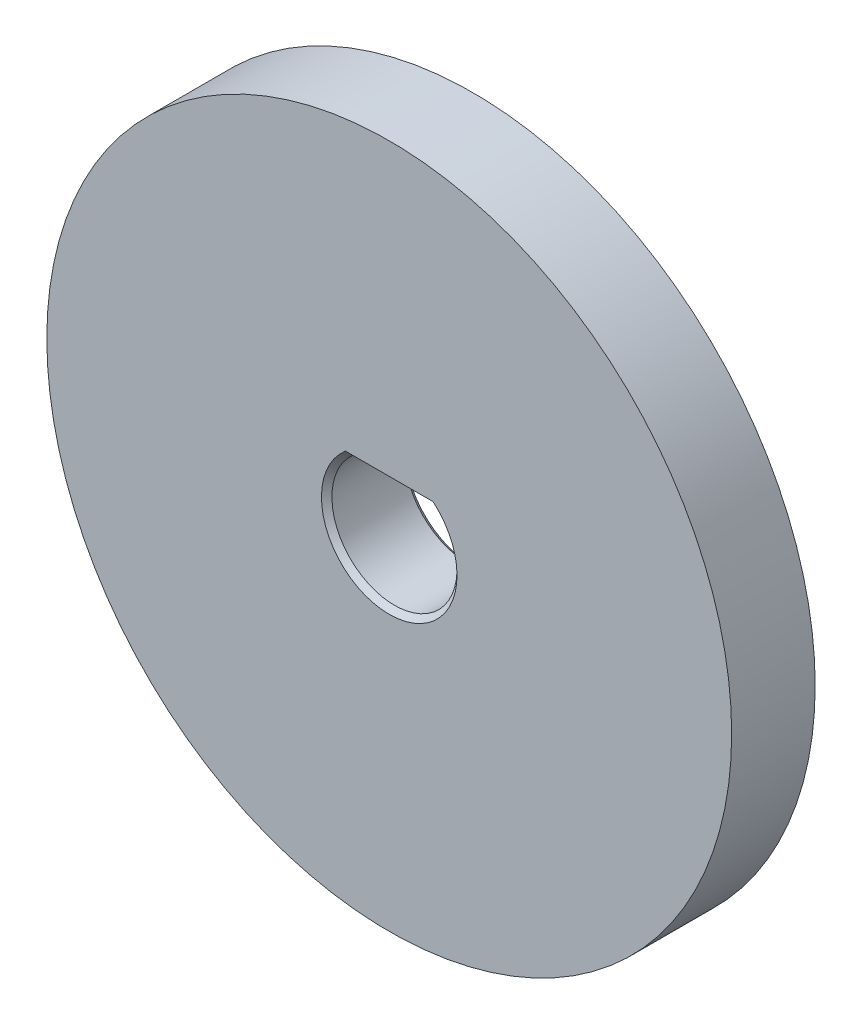
ISO-10303-21;
HEADER;
FILE_DESCRIPTION(('STEP AP214'),'2;1');
FILE_NAME('part.step','',(''),(''),'','','');
FILE_SCHEMA(('AUTOMOTIVE_DESIGN { 1 0 10303 214 1 1 1 1 }'));
ENDSEC;
DATA;
#1=APPLICATION_CONTEXT('core data for automotive mechanical design processes');
#2=APPLICATION_PROTOCOL_DEFINITION('international standard','automotive_design',2000,#1);
#3=PRODUCT_CONTEXT('',#1,'mechanical');
#4=PRODUCT('Part','Part','',(#3));
#5=PRODUCT_RELATED_PRODUCT_CATEGORY('part','',(#4));
#6=PRODUCT_DEFINITION_FORMATION('','',#4);
#7=PRODUCT_DEFINITION_CONTEXT('part definition',#1,'design');
#8=PRODUCT_DEFINITION('design','',#6,#7);
#9=PRODUCT_DEFINITION_SHAPE('','',#8);
#10=(LENGTH_UNIT() NAMED_UNIT(*) SI_UNIT(.MILLI.,.METRE.));
#11=(NAMED_UNIT(*) PLANE_ANGLE_UNIT() SI_UNIT($,.RADIAN.));
#12=(NAMED_UNIT(*) SI_UNIT($,.STERADIAN.) SOLID_ANGLE_UNIT());
#13=UNCERTAINTY_MEASURE_WITH_UNIT(LENGTH_MEASURE(1.E-05),#10,'distance_accuracy_value','');
#14=(GEOMETRIC_REPRESENTATION_CONTEXT(3) GLOBAL_UNCERTAINTY_ASSIGNED_CONTEXT((#13)) GLOBAL_UNIT_ASSIGNED_CONTEXT((#10,
#11,#12)) REPRESENTATION_CONTEXT('',''));
#15=CARTESIAN_POINT('',(0.,0.,0.));
#16=DIRECTION('',(0.,0.,1.));
#17=DIRECTION('',(1.,0.,0.));
#18=AXIS2_PLACEMENT_3D('',#15,#16,#17);
#19=CARTESIAN_POINT('',(0.,0.,6.35));
#20=DIRECTION('',(0.,0.,1.));
#21=DIRECTION('',(1.,0.,0.));
#22=AXIS2_PLACEMENT_3D('',#19,#20,#21);
#23=PLANE('',#22);
#24=DIRECTION('',(1.,0.,0.));
#25=VECTOR('',#24,1.);
#26=CARTESIAN_POINT('',(0.,7.86892000000001,6.35));
#27=LINE('',#26,#25);
#28=CARTESIAN_POINT('',(-6.65739766094843,7.86892000000001,6.35));
#29=VERTEX_POINT('',#28);
#30=CARTESIAN_POINT('',(6.65739766094843,7.86892000000001,6.35));
#31=VERTEX_POINT('',#30);
#32=EDGE_CURVE('E111',#29,#31,#27,.T.);
#33=ORIENTED_EDGE('',*,*,#32,.T.);
#34=CARTESIAN_POINT('',(0.,0.,6.35));
#35=DIRECTION('',(0.,0.,1.));
#36=DIRECTION('',(1.,0.,0.));
#37=AXIS2_PLACEMENT_3D('',#34,#35,#36);
#38=CIRCLE('',#37,10.30732);
#39=EDGE_CURVE('E119',#31,#29,#38,.F.);
#40=ORIENTED_EDGE('',*,*,#39,.T.);
#41=EDGE_LOOP('',(#33,#40));
#42=FACE_BOUND('',#41,.T.);
#43=CARTESIAN_POINT('',(0.,0.,6.35));
#44=DIRECTION('',(0.,0.,1.));
#45=DIRECTION('',(1.,0.,0.));
#46=AXIS2_PLACEMENT_3D('',#43,#44,#45);
#47=CIRCLE('',#46,52.07);
#48=CARTESIAN_POINT('',(52.07,0.,6.35));
#49=VERTEX_POINT('',#48);
#50=EDGE_CURVE('E121',#49,#49,#47,.T.);
#51=ORIENTED_EDGE('',*,*,#50,.T.);
#52=EDGE_LOOP('',(#51));
#53=FACE_BOUND('',#52,.T.);
#54=ADVANCED_FACE('F38',(#42,#53),#23,.T.);
#55=CARTESIAN_POINT('',(0.,0.,-6.35));
#56=DIRECTION('',(0.,0.,1.));
#57=DIRECTION('',(1.,0.,0.));
#58=AXIS2_PLACEMENT_3D('',#55,#56,#57);
#59=PLANE('',#58);
#60=CARTESIAN_POINT('',(0.,0.,-6.35));
#61=DIRECTION('',(0.,0.,1.));
#62=DIRECTION('',(1.,0.,0.));
#63=AXIS2_PLACEMENT_3D('',#60,#61,#62);
#64=CIRCLE('',#63,10.30732);
#65=CARTESIAN_POINT('',(-6.65739766094842,7.86891999999988,-6.35));
#66=VERTEX_POINT('',#65);
#67=CARTESIAN_POINT('',(6.65739766094842,7.86891999999988,-6.35));
#68=VERTEX_POINT('',#67);
#69=EDGE_CURVE('E53',#66,#68,#64,.T.);
#70=ORIENTED_EDGE('',*,*,#69,.T.);
#71=DIRECTION('',(-1.,0.,0.));
#72=VECTOR('',#71,1.);
#73=CARTESIAN_POINT('',(-6.35954322888051,7.86891999999998,-6.35));
#74=LINE('',#73,#72);
#75=EDGE_CURVE('E11',#68,#66,#74,.T.);
#76=ORIENTED_EDGE('',*,*,#75,.T.);
#77=EDGE_LOOP('',(#70,#76));
#78=FACE_BOUND('',#77,.T.);
#79=CARTESIAN_POINT('',(0.,0.,-6.35));
#80=DIRECTION('',(0.,0.,1.));
#81=DIRECTION('',(1.,0.,0.));
#82=AXIS2_PLACEMENT_3D('',#79,#80,#81);
#83=CIRCLE('',#82,52.07);
#84=CARTESIAN_POINT('',(52.07,0.,-6.35));
#85=VERTEX_POINT('',#84);
#86=EDGE_CURVE('E159',#85,#85,#83,.T.);
#87=ORIENTED_EDGE('',*,*,#86,.F.);
#88=EDGE_LOOP('',(#87));
#89=FACE_BOUND('',#88,.T.);
#90=ADVANCED_FACE('F170',(#78,#89),#59,.F.);
#91=CARTESIAN_POINT('',(0.,0.,6.35));
#92=DIRECTION('',(0.,0.,-1.));
#93=DIRECTION('',(-1.,0.,0.));
#94=AXIS2_PLACEMENT_3D('',#91,#92,#93);
#95=CYLINDRICAL_SURFACE('',#94,52.07);
#96=ORIENTED_EDGE('',*,*,#50,.F.);
#97=EDGE_LOOP('',(#96));
#98=FACE_BOUND('',#97,.T.);
#99=ORIENTED_EDGE('',*,*,#86,.T.);
#100=EDGE_LOOP('',(#99));
#101=FACE_BOUND('',#100,.T.);
#102=ADVANCED_FACE('F167',(#98,#101),#95,.T.);
#103=CARTESIAN_POINT('',(0.,0.,6.35));
#104=DIRECTION('',(0.,0.,-1.));
#105=DIRECTION('',(-1.,0.,0.));
#106=AXIS2_PLACEMENT_3D('',#103,#104,#105);
#107=CYLINDRICAL_SURFACE('',#106,9.5123);
#108=DIRECTION('',(0.,0.,-1.));
#109=VECTOR('',#108,1.);
#110=CARTESIAN_POINT('',(-6.35954322888052,7.0739,19.3007125240274));
#111=LINE('',#110,#109);
#112=CARTESIAN_POINT('',(-6.35954322888052,7.0739,5.55497999999999));
#113=VERTEX_POINT('',#112);
#114=CARTESIAN_POINT('',(-6.35954322888052,7.0739,-5.55498000000003));
#115=VERTEX_POINT('',#114);
#116=EDGE_CURVE('E92',#113,#115,#111,.T.);
#117=ORIENTED_EDGE('',*,*,#116,.F.);
#118=CARTESIAN_POINT('',(0.,0.,5.55497999999999));
#119=DIRECTION('',(0.,0.,1.));
#120=DIRECTION('',(1.,0.,0.));
#121=AXIS2_PLACEMENT_3D('',#118,#119,#120);
#122=CIRCLE('',#121,9.5123);
#123=CARTESIAN_POINT('',(6.35954322888052,7.0739,5.55497999999999));
#124=VERTEX_POINT('',#123);
#125=EDGE_CURVE('E104',#113,#124,#122,.T.);
#126=ORIENTED_EDGE('',*,*,#125,.T.);
#127=DIRECTION('',(0.,0.,-1.));
#128=VECTOR('',#127,1.);
#129=CARTESIAN_POINT('',(6.35954322888052,7.0739,19.3007125240274));
#130=LINE('',#129,#128);
#131=CARTESIAN_POINT('',(6.35954322888052,7.0739,-5.55498000000003));
#132=VERTEX_POINT('',#131);
#133=EDGE_CURVE('E94',#124,#132,#130,.T.);
#134=ORIENTED_EDGE('',*,*,#133,.T.);
#135=CARTESIAN_POINT('',(0.,0.,-5.55498000000003));
#136=DIRECTION('',(0.,0.,1.));
#137=DIRECTION('',(1.,0.,0.));
#138=AXIS2_PLACEMENT_3D('',#135,#136,#137);
#139=CIRCLE('',#138,9.5123);
#140=EDGE_CURVE('E106',#132,#115,#139,.F.);
#141=ORIENTED_EDGE('',*,*,#140,.T.);
#142=EDGE_LOOP('',(#117,#126,#134,#141));
#143=FACE_BOUND('',#142,.T.);
#144=ADVANCED_FACE('F102',(#143),#107,.F.);
#145=CARTESIAN_POINT('',(6.35954322888052,7.0739,19.3007125240274));
#146=DIRECTION('',(0.,-1.,0.));
#147=DIRECTION('',(0.,0.,-1.));
#148=AXIS2_PLACEMENT_3D('',#145,#146,#147);
#149=PLANE('',#148);
#150=ORIENTED_EDGE('',*,*,#133,.F.);
#151=DIRECTION('',(-1.,0.,0.));
#152=VECTOR('',#151,1.);
#153=CARTESIAN_POINT('',(6.35954322888052,7.0739,5.55497999999999));
#154=LINE('',#153,#152);
#155=EDGE_CURVE('E88',#124,#113,#154,.T.);
#156=ORIENTED_EDGE('',*,*,#155,.T.);
#157=ORIENTED_EDGE('',*,*,#116,.T.);
#158=DIRECTION('',(1.,0.,0.));
#159=VECTOR('',#158,1.);
#160=CARTESIAN_POINT('',(6.35954322888051,7.0739,-5.55498000000003));
#161=LINE('',#160,#159);
#162=EDGE_CURVE('E99',#115,#132,#161,.T.);
#163=ORIENTED_EDGE('',*,*,#162,.T.);
#164=EDGE_LOOP('',(#150,#156,#157,#163));
#165=FACE_BOUND('',#164,.T.);
#166=ADVANCED_FACE('F90',(#165),#149,.T.);
#167=CARTESIAN_POINT('',(6.35954322888052,7.0739,5.55497999999999));
#168=DIRECTION('',(0.,0.707106781186547,-0.707106781186547));
#169=DIRECTION('',(-1.,0.,0.));
#170=AXIS2_PLACEMENT_3D('',#167,#168,#169);
#171=PLANE('',#170);
#172=CARTESIAN_POINT('',(6.35954322888052,7.0739,5.55497999999999));
#173=CARTESIAN_POINT('',(6.41024695727607,7.20620456649276,5.68728456649275));
#174=CARTESIAN_POINT('',(6.46042003196174,7.33860853775445,5.81968853775444));
#175=CARTESIAN_POINT('',(6.55970484196815,7.60361520454902,6.08469520454902));
#176=CARTESIAN_POINT('',(6.60881657797184,7.73621789995397,6.21729789995397));
#177=CARTESIAN_POINT('',(6.6573976609486,7.86891999999993,6.34999999999992));
#178=B_SPLINE_CURVE_WITH_KNOTS('',3,(#172,#173,#174,#175,#176,#177),.UNSPECIFIED.,.F.,.F.,(4,2,
4),(0.,0.581558806756749,1.16311723927708),.UNSPECIFIED.);
#179=EDGE_CURVE('E115',#31,#124,#178,.F.);
#180=ORIENTED_EDGE('',*,*,#179,.F.);
#181=ORIENTED_EDGE('',*,*,#32,.F.);
#182=CARTESIAN_POINT('',(-6.65739766094843,7.86891999999991,6.35));
#183=CARTESIAN_POINT('',(-6.60881657797171,7.73621789995398,6.21729789995402));
#184=CARTESIAN_POINT('',(-6.55970484196807,7.60361520454903,6.08469520454904));
#185=CARTESIAN_POINT('',(-6.46042003196181,7.33860853775444,5.81968853775442));
#186=CARTESIAN_POINT('',(-6.41024695727623,7.20620456649273,5.68728456649271));
#187=CARTESIAN_POINT('',(-6.35954322888077,7.07389999999995,5.55497999999995));
#188=B_SPLINE_CURVE_WITH_KNOTS('',3,(#182,#183,#184,#185,#186,#187),.UNSPECIFIED.,.F.,.F.,(4,2,
4),(0.,0.58155843252033,1.16311723927708),.UNSPECIFIED.);
#189=EDGE_CURVE('E107',#113,#29,#188,.F.);
#190=ORIENTED_EDGE('',*,*,#189,.F.);
#191=ORIENTED_EDGE('',*,*,#155,.F.);
#192=EDGE_LOOP('',(#180,#181,#190,#191));
#193=FACE_BOUND('',#192,.T.);
#194=ADVANCED_FACE('F110',(#193),#171,.F.);
#195=CARTESIAN_POINT('',(0.,0.,5.55497999999999));
#196=DIRECTION('',(0.,0.,1.));
#197=DIRECTION('',(1.,0.,0.));
#198=AXIS2_PLACEMENT_3D('',#195,#196,#197);
#199=CONICAL_SURFACE('',#198,9.5123,0.785398163397448);
#200=ORIENTED_EDGE('',*,*,#189,.T.);
#201=ORIENTED_EDGE('',*,*,#39,.F.);
#202=ORIENTED_EDGE('',*,*,#179,.T.);
#203=ORIENTED_EDGE('',*,*,#125,.F.);
#204=EDGE_LOOP('',(#200,#201,#202,#203));
#205=FACE_BOUND('',#204,.T.);
#206=ADVANCED_FACE('F117',(#205),#199,.F.);
#207=CARTESIAN_POINT('',(0.,0.,-6.35));
#208=DIRECTION('',(0.,0.,-1.));
#209=DIRECTION('',(-1.,0.,0.));
#210=AXIS2_PLACEMENT_3D('',#207,#208,#209);
#211=CONICAL_SURFACE('',#210,10.30732,0.785398163397454);
#212=CARTESIAN_POINT('',(-6.6573976609485,7.86891999999998,-6.35));
#213=CARTESIAN_POINT('',(-6.60881657797175,7.73621789995402,-6.21729789995404));
#214=CARTESIAN_POINT('',(-6.5597048419681,7.60361520454906,-6.08469520454908));
#215=CARTESIAN_POINT('',(-6.46042003196181,7.33860853775445,-5.81968853775447));
#216=CARTESIAN_POINT('',(-6.41024695727622,7.20620456649273,-5.68728456649276));
#217=CARTESIAN_POINT('',(-6.35954322888077,7.07389999999995,-5.55497999999998));
#218=B_SPLINE_CURVE_WITH_KNOTS('',3,(#212,#213,#214,#215,#216,#217),.UNSPECIFIED.,.F.,.F.,(4,2,
4),(0.,0.581558432520353,1.16311723927712),.UNSPECIFIED.);
#219=EDGE_CURVE('E66',#115,#66,#218,.F.);
#220=ORIENTED_EDGE('',*,*,#219,.F.);
#221=ORIENTED_EDGE('',*,*,#140,.F.);
#222=CARTESIAN_POINT('',(6.35954322888052,7.0739,-5.55498000000003));
#223=CARTESIAN_POINT('',(6.41024695727607,7.20620456649276,-5.68728456649279));
#224=CARTESIAN_POINT('',(6.46042003196175,7.33860853775446,-5.81968853775448));
#225=CARTESIAN_POINT('',(6.55970484196816,7.60361520454905,-6.08469520454907));
#226=CARTESIAN_POINT('',(6.60881657797185,7.736217899954,-6.21729789995402));
#227=CARTESIAN_POINT('',(6.65739766094861,7.86891999999996,-6.34999999999998));
#228=B_SPLINE_CURVE_WITH_KNOTS('',3,(#222,#223,#224,#225,#226,#227),.UNSPECIFIED.,.F.,.F.,(4,2,
4),(0.,0.581558806756772,1.16311723927712),.UNSPECIFIED.);
#229=EDGE_CURVE('E44',#68,#132,#228,.F.);
#230=ORIENTED_EDGE('',*,*,#229,.F.);
#231=ORIENTED_EDGE('',*,*,#69,.F.);
#232=EDGE_LOOP('',(#220,#221,#230,#231));
#233=FACE_BOUND('',#232,.T.);
#234=ADVANCED_FACE('F41',(#233),#211,.F.);
#235=CARTESIAN_POINT('',(0.,7.86891999999998,-6.35));
#236=DIRECTION('',(0.,-0.707106781186543,-0.707106781186552));
#237=DIRECTION('',(1.,0.,0.));
#238=AXIS2_PLACEMENT_3D('',#235,#236,#237);
#239=PLANE('',#238);
#240=ORIENTED_EDGE('',*,*,#229,.T.);
#241=ORIENTED_EDGE('',*,*,#162,.F.);
#242=ORIENTED_EDGE('',*,*,#219,.T.);
#243=ORIENTED_EDGE('',*,*,#75,.F.);
#244=EDGE_LOOP('',(#240,#241,#242,#243));
#245=FACE_BOUND('',#244,.T.);
#246=ADVANCED_FACE('F147',(#245),#239,.T.);
#247=CLOSED_SHELL('',(#54,#90,#102,#144,#166,#194,#206,#234,#246));
#248=MANIFOLD_SOLID_BREP('B2',#247);
#249=ADVANCED_BREP_SHAPE_REPRESENTATION('',(#18,#248),#14);
#250=SHAPE_DEFINITION_REPRESENTATION(#9,#249);
ENDSEC;
END-ISO-10303-21;
